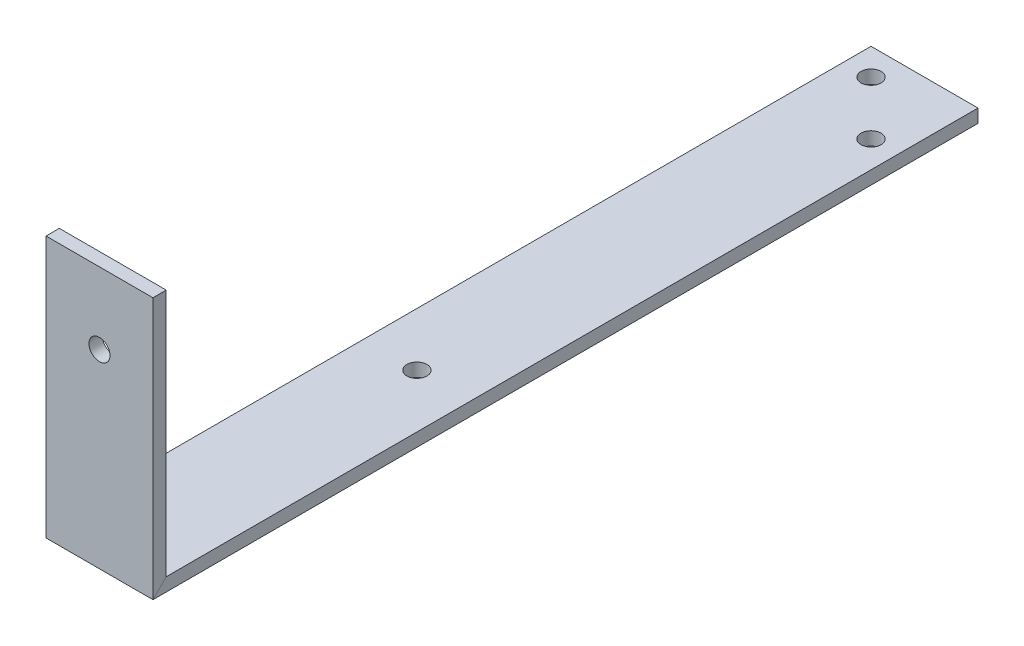
ISO-10303-21;
HEADER;
FILE_DESCRIPTION(('STEP AP214'),'2;1');
FILE_NAME('part.step','',(''),(''),'','','');
FILE_SCHEMA(('AUTOMOTIVE_DESIGN { 1 0 10303 214 1 1 1 1 }'));
ENDSEC;
DATA;
#1=APPLICATION_CONTEXT('core data for automotive mechanical design processes');
#2=APPLICATION_PROTOCOL_DEFINITION('international standard','automotive_design',2000,#1);
#3=PRODUCT_CONTEXT('',#1,'mechanical');
#4=PRODUCT('Part','Part','',(#3));
#5=PRODUCT_RELATED_PRODUCT_CATEGORY('part','',(#4));
#6=PRODUCT_DEFINITION_FORMATION('','',#4);
#7=PRODUCT_DEFINITION_CONTEXT('part definition',#1,'design');
#8=PRODUCT_DEFINITION('design','',#6,#7);
#9=PRODUCT_DEFINITION_SHAPE('','',#8);
#10=(LENGTH_UNIT() NAMED_UNIT(*) SI_UNIT(.MILLI.,.METRE.));
#11=(NAMED_UNIT(*) PLANE_ANGLE_UNIT() SI_UNIT($,.RADIAN.));
#12=(NAMED_UNIT(*) SI_UNIT($,.STERADIAN.) SOLID_ANGLE_UNIT());
#13=UNCERTAINTY_MEASURE_WITH_UNIT(LENGTH_MEASURE(1.E-05),#10,'distance_accuracy_value','');
#14=(GEOMETRIC_REPRESENTATION_CONTEXT(3) GLOBAL_UNCERTAINTY_ASSIGNED_CONTEXT((#13)) GLOBAL_UNIT_ASSIGNED_CONTEXT((#10,
#11,#12)) REPRESENTATION_CONTEXT('',''));
#15=CARTESIAN_POINT('',(0.,0.,0.));
#16=DIRECTION('',(0.,0.,1.));
#17=DIRECTION('',(1.,0.,0.));
#18=AXIS2_PLACEMENT_3D('',#15,#16,#17);
#19=CARTESIAN_POINT('',(1761.3,-570.8105,696.315));
#20=DIRECTION('',(0.,0.,-1.));
#21=DIRECTION('',(-1.,0.,0.));
#22=AXIS2_PLACEMENT_3D('',#19,#20,#21);
#23=PLANE('',#22);
#24=CARTESIAN_POINT('',(1786.7,-480.185,696.315));
#25=DIRECTION('',(0.,0.,-1.));
#26=DIRECTION('',(-1.,0.,0.));
#27=AXIS2_PLACEMENT_3D('',#24,#25,#26);
#28=CIRCLE('',#27,4.99999999999982);
#29=CARTESIAN_POINT('',(1781.7,-480.185,696.315));
#30=VERTEX_POINT('',#29);
#31=EDGE_CURVE('E136',#30,#30,#28,.T.);
#32=ORIENTED_EDGE('',*,*,#31,.T.);
#33=EDGE_LOOP('',(#32));
#34=FACE_BOUND('',#33,.T.);
#35=DIRECTION('',(1.,0.,0.));
#36=VECTOR('',#35,1.);
#37=CARTESIAN_POINT('',(0.,-446.185,696.315));
#38=LINE('',#37,#36);
#39=CARTESIAN_POINT('',(1761.3,-446.185,696.315));
#40=VERTEX_POINT('',#39);
#41=CARTESIAN_POINT('',(1812.1,-446.185,696.315));
#42=VERTEX_POINT('',#41);
#43=EDGE_CURVE('E158',#40,#42,#38,.T.);
#44=ORIENTED_EDGE('',*,*,#43,.F.);
#45=DIRECTION('',(0.,1.,0.));
#46=VECTOR('',#45,1.);
#47=CARTESIAN_POINT('',(1761.3,-570.8105,696.315));
#48=LINE('',#47,#46);
#49=CARTESIAN_POINT('',(1761.3,-570.395,696.315));
#50=VERTEX_POINT('',#49);
#51=EDGE_CURVE('E127',#50,#40,#48,.T.);
#52=ORIENTED_EDGE('',*,*,#51,.F.);
#53=DIRECTION('',(1.,0.,0.));
#54=VECTOR('',#53,1.);
#55=CARTESIAN_POINT('',(1761.3,-570.395,696.315));
#56=LINE('',#55,#54);
#57=CARTESIAN_POINT('',(1812.1,-570.395,696.315));
#58=VERTEX_POINT('',#57);
#59=EDGE_CURVE('E116',#50,#58,#56,.T.);
#60=ORIENTED_EDGE('',*,*,#59,.T.);
#61=DIRECTION('',(0.,1.,0.));
#62=VECTOR('',#61,1.);
#63=CARTESIAN_POINT('',(1812.1,-570.8105,696.315));
#64=LINE('',#63,#62);
#65=EDGE_CURVE('E117',#58,#42,#64,.T.);
#66=ORIENTED_EDGE('',*,*,#65,.T.);
#67=EDGE_LOOP('',(#44,#52,#60,#66));
#68=FACE_BOUND('',#67,.T.);
#69=ADVANCED_FACE('F34',(#34,#68),#23,.F.);
#70=CARTESIAN_POINT('',(1812.1,-570.8105,696.315));
#71=DIRECTION('',(-1.,0.,0.));
#72=DIRECTION('',(0.,0.,1.));
#73=AXIS2_PLACEMENT_3D('',#70,#71,#72);
#74=PLANE('',#73);
#75=DIRECTION('',(0.,0.,-1.));
#76=VECTOR('',#75,1.);
#77=CARTESIAN_POINT('',(1812.1,-446.185,696.315));
#78=LINE('',#77,#76);
#79=CARTESIAN_POINT('',(1812.1,-446.185,690.005));
#80=VERTEX_POINT('',#79);
#81=EDGE_CURVE('E121',#42,#80,#78,.T.);
#82=ORIENTED_EDGE('',*,*,#81,.F.);
#83=ORIENTED_EDGE('',*,*,#65,.F.);
#84=DIRECTION('',(0.,0.707106781186548,-0.707106781186548));
#85=VECTOR('',#84,1.);
#86=CARTESIAN_POINT('',(1812.1,-376.3175,502.2375));
#87=LINE('',#86,#85);
#88=CARTESIAN_POINT('',(1812.1,-564.085,690.005));
#89=VERTEX_POINT('',#88);
#90=EDGE_CURVE('E42',#58,#89,#87,.T.);
#91=ORIENTED_EDGE('',*,*,#90,.T.);
#92=DIRECTION('',(0.,1.,0.));
#93=VECTOR('',#92,1.);
#94=CARTESIAN_POINT('',(1812.1,-570.8105,690.005));
#95=LINE('',#94,#93);
#96=EDGE_CURVE('E120',#89,#80,#95,.T.);
#97=ORIENTED_EDGE('',*,*,#96,.T.);
#98=EDGE_LOOP('',(#82,#83,#91,#97));
#99=FACE_BOUND('',#98,.T.);
#100=ADVANCED_FACE('F175',(#99),#74,.F.);
#101=CARTESIAN_POINT('',(1761.3,-570.8105,690.005));
#102=DIRECTION('',(0.,0.,1.));
#103=DIRECTION('',(1.,0.,0.));
#104=AXIS2_PLACEMENT_3D('',#101,#102,#103);
#105=PLANE('',#104);
#106=CARTESIAN_POINT('',(1786.7,-480.185,690.005));
#107=DIRECTION('',(0.,0.,-1.));
#108=DIRECTION('',(-1.,0.,0.));
#109=AXIS2_PLACEMENT_3D('',#106,#107,#108);
#110=CIRCLE('',#109,4.99999999999982);
#111=CARTESIAN_POINT('',(1781.7,-480.185,690.005));
#112=VERTEX_POINT('',#111);
#113=EDGE_CURVE('E131',#112,#112,#110,.T.);
#114=ORIENTED_EDGE('',*,*,#113,.F.);
#115=EDGE_LOOP('',(#114));
#116=FACE_BOUND('',#115,.T.);
#117=DIRECTION('',(-1.,0.,0.));
#118=VECTOR('',#117,1.);
#119=CARTESIAN_POINT('',(0.,-446.185,690.005));
#120=LINE('',#119,#118);
#121=CARTESIAN_POINT('',(1761.3,-446.185,690.005));
#122=VERTEX_POINT('',#121);
#123=EDGE_CURVE('E58',#80,#122,#120,.T.);
#124=ORIENTED_EDGE('',*,*,#123,.F.);
#125=ORIENTED_EDGE('',*,*,#96,.F.);
#126=DIRECTION('',(-1.,0.,0.));
#127=VECTOR('',#126,1.);
#128=CARTESIAN_POINT('',(1761.3,-564.085,690.005));
#129=LINE('',#128,#127);
#130=CARTESIAN_POINT('',(1761.3,-564.085,690.005));
#131=VERTEX_POINT('',#130);
#132=EDGE_CURVE('E11',#89,#131,#129,.T.);
#133=ORIENTED_EDGE('',*,*,#132,.T.);
#134=DIRECTION('',(0.,1.,0.));
#135=VECTOR('',#134,1.);
#136=CARTESIAN_POINT('',(1761.3,-570.8105,690.005));
#137=LINE('',#136,#135);
#138=EDGE_CURVE('E124',#131,#122,#137,.T.);
#139=ORIENTED_EDGE('',*,*,#138,.T.);
#140=EDGE_LOOP('',(#124,#125,#133,#139));
#141=FACE_BOUND('',#140,.T.);
#142=ADVANCED_FACE('F182',(#116,#141),#105,.F.);
#143=CARTESIAN_POINT('',(1761.3,-570.8105,696.315));
#144=DIRECTION('',(1.,0.,0.));
#145=DIRECTION('',(0.,0.,-1.));
#146=AXIS2_PLACEMENT_3D('',#143,#144,#145);
#147=PLANE('',#146);
#148=DIRECTION('',(0.,0.,1.));
#149=VECTOR('',#148,1.);
#150=CARTESIAN_POINT('',(1761.3,-446.185,0.));
#151=LINE('',#150,#149);
#152=EDGE_CURVE('E156',#122,#40,#151,.T.);
#153=ORIENTED_EDGE('',*,*,#152,.F.);
#154=ORIENTED_EDGE('',*,*,#138,.F.);
#155=DIRECTION('',(0.,-0.707106781186548,0.707106781186548));
#156=VECTOR('',#155,1.);
#157=CARTESIAN_POINT('',(1761.3,-376.3175,502.2375));
#158=LINE('',#157,#156);
#159=EDGE_CURVE('E106',#131,#50,#158,.T.);
#160=ORIENTED_EDGE('',*,*,#159,.T.);
#161=ORIENTED_EDGE('',*,*,#51,.T.);
#162=EDGE_LOOP('',(#153,#154,#160,#161));
#163=FACE_BOUND('',#162,.T.);
#164=ADVANCED_FACE('F179',(#163),#147,.F.);
#165=CARTESIAN_POINT('',(1761.3,-570.395,308.16));
#166=DIRECTION('',(0.,1.,0.));
#167=DIRECTION('',(0.,0.,1.));
#168=AXIS2_PLACEMENT_3D('',#165,#166,#167);
#169=PLANE('',#168);
#170=CARTESIAN_POINT('',(1773.99999999906,-570.395,317.152204665887));
#171=DIRECTION('',(0.,-1.,0.));
#172=DIRECTION('',(0.,0.,-1.));
#173=AXIS2_PLACEMENT_3D('',#170,#171,#172);
#174=CIRCLE('',#173,4.7624999999999);
#175=CARTESIAN_POINT('',(1773.99999999906,-570.395,312.389704665887));
#176=VERTEX_POINT('',#175);
#177=EDGE_CURVE('E143',#176,#176,#174,.T.);
#178=ORIENTED_EDGE('',*,*,#177,.F.);
#179=EDGE_LOOP('',(#178));
#180=FACE_BOUND('',#179,.T.);
#181=CARTESIAN_POINT('',(1799.39999999906,-570.395,342.552204665886));
#182=DIRECTION('',(0.,-1.,0.));
#183=DIRECTION('',(0.,0.,-1.));
#184=AXIS2_PLACEMENT_3D('',#181,#182,#183);
#185=CIRCLE('',#184,4.76250000000011);
#186=CARTESIAN_POINT('',(1799.39999999906,-570.395,337.789704665886));
#187=VERTEX_POINT('',#186);
#188=EDGE_CURVE('E132',#187,#187,#185,.T.);
#189=ORIENTED_EDGE('',*,*,#188,.F.);
#190=EDGE_LOOP('',(#189));
#191=FACE_BOUND('',#190,.T.);
#192=CARTESIAN_POINT('',(1786.69999999999,-570.395,545.545000000005));
#193=DIRECTION('',(0.,1.,0.));
#194=DIRECTION('',(0.,0.,1.));
#195=AXIS2_PLACEMENT_3D('',#192,#193,#194);
#196=CIRCLE('',#195,4.76249999999989);
#197=CARTESIAN_POINT('',(1786.69999999999,-570.395,550.307500000005));
#198=VERTEX_POINT('',#197);
#199=EDGE_CURVE('E102',#198,#198,#196,.T.);
#200=ORIENTED_EDGE('',*,*,#199,.T.);
#201=EDGE_LOOP('',(#200));
#202=FACE_BOUND('',#201,.T.);
#203=DIRECTION('',(0.,0.,1.));
#204=VECTOR('',#203,1.);
#205=CARTESIAN_POINT('',(1761.3,-570.395,308.16));
#206=LINE('',#205,#204);
#207=CARTESIAN_POINT('',(1761.3,-570.395,304.45));
#208=VERTEX_POINT('',#207);
#209=EDGE_CURVE('E108',#208,#50,#206,.T.);
#210=ORIENTED_EDGE('',*,*,#209,.F.);
#211=DIRECTION('',(1.,0.,0.));
#212=VECTOR('',#211,1.);
#213=CARTESIAN_POINT('',(1761.3,-570.395,304.45));
#214=LINE('',#213,#212);
#215=CARTESIAN_POINT('',(1812.1,-570.395,304.45));
#216=VERTEX_POINT('',#215);
#217=EDGE_CURVE('E50',#208,#216,#214,.T.);
#218=ORIENTED_EDGE('',*,*,#217,.T.);
#219=DIRECTION('',(0.,0.,1.));
#220=VECTOR('',#219,1.);
#221=CARTESIAN_POINT('',(1812.1,-570.395,308.16));
#222=LINE('',#221,#220);
#223=EDGE_CURVE('E111',#216,#58,#222,.T.);
#224=ORIENTED_EDGE('',*,*,#223,.T.);
#225=ORIENTED_EDGE('',*,*,#59,.F.);
#226=EDGE_LOOP('',(#210,#218,#224,#225));
#227=FACE_BOUND('',#226,.T.);
#228=ADVANCED_FACE('F168',(#180,#191,#202,#227),#169,.F.);
#229=CARTESIAN_POINT('',(1812.1,-570.395,308.16));
#230=DIRECTION('',(-1.,0.,0.));
#231=DIRECTION('',(0.,0.,1.));
#232=AXIS2_PLACEMENT_3D('',#229,#230,#231);
#233=PLANE('',#232);
#234=ORIENTED_EDGE('',*,*,#223,.F.);
#235=DIRECTION('',(0.,1.,0.));
#236=VECTOR('',#235,1.);
#237=CARTESIAN_POINT('',(1812.1,-570.435,304.45));
#238=LINE('',#237,#236);
#239=CARTESIAN_POINT('',(1812.1,-564.085,304.45));
#240=VERTEX_POINT('',#239);
#241=EDGE_CURVE('E93',#216,#240,#238,.T.);
#242=ORIENTED_EDGE('',*,*,#241,.T.);
#243=DIRECTION('',(0.,0.,1.));
#244=VECTOR('',#243,1.);
#245=CARTESIAN_POINT('',(1812.1,-564.085,308.16));
#246=LINE('',#245,#244);
#247=EDGE_CURVE('E101',#240,#89,#246,.T.);
#248=ORIENTED_EDGE('',*,*,#247,.T.);
#249=ORIENTED_EDGE('',*,*,#90,.F.);
#250=EDGE_LOOP('',(#234,#242,#248,#249));
#251=FACE_BOUND('',#250,.T.);
#252=ADVANCED_FACE('F172',(#251),#233,.F.);
#253=CARTESIAN_POINT('',(1761.3,-564.085,308.16));
#254=DIRECTION('',(0.,-1.,0.));
#255=DIRECTION('',(0.,0.,-1.));
#256=AXIS2_PLACEMENT_3D('',#253,#254,#255);
#257=PLANE('',#256);
#258=CARTESIAN_POINT('',(1773.99999999906,-564.085,317.152204665887));
#259=DIRECTION('',(0.,-1.,0.));
#260=DIRECTION('',(0.,0.,-1.));
#261=AXIS2_PLACEMENT_3D('',#258,#259,#260);
#262=CIRCLE('',#261,4.7624999999999);
#263=CARTESIAN_POINT('',(1773.99999999906,-564.085,312.389704665887));
#264=VERTEX_POINT('',#263);
#265=EDGE_CURVE('E37',#264,#264,#262,.T.);
#266=ORIENTED_EDGE('',*,*,#265,.T.);
#267=EDGE_LOOP('',(#266));
#268=FACE_BOUND('',#267,.T.);
#269=CARTESIAN_POINT('',(1799.39999999906,-564.085,342.552204665886));
#270=DIRECTION('',(0.,-1.,0.));
#271=DIRECTION('',(0.,0.,-1.));
#272=AXIS2_PLACEMENT_3D('',#269,#270,#271);
#273=CIRCLE('',#272,4.76250000000011);
#274=CARTESIAN_POINT('',(1799.39999999906,-564.085,337.789704665886));
#275=VERTEX_POINT('',#274);
#276=EDGE_CURVE('E129',#275,#275,#273,.T.);
#277=ORIENTED_EDGE('',*,*,#276,.T.);
#278=EDGE_LOOP('',(#277));
#279=FACE_BOUND('',#278,.T.);
#280=CARTESIAN_POINT('',(1786.69999999999,-564.085,545.545000000005));
#281=DIRECTION('',(0.,1.,0.));
#282=DIRECTION('',(0.,0.,1.));
#283=AXIS2_PLACEMENT_3D('',#280,#281,#282);
#284=CIRCLE('',#283,4.76249999999989);
#285=CARTESIAN_POINT('',(1786.69999999999,-564.085,550.307500000005));
#286=VERTEX_POINT('',#285);
#287=EDGE_CURVE('E148',#286,#286,#284,.T.);
#288=ORIENTED_EDGE('',*,*,#287,.F.);
#289=EDGE_LOOP('',(#288));
#290=FACE_BOUND('',#289,.T.);
#291=ORIENTED_EDGE('',*,*,#247,.F.);
#292=DIRECTION('',(1.,0.,0.));
#293=VECTOR('',#292,1.);
#294=CARTESIAN_POINT('',(1812.1,-564.085,304.45));
#295=LINE('',#294,#293);
#296=CARTESIAN_POINT('',(1761.3,-564.085,304.45));
#297=VERTEX_POINT('',#296);
#298=EDGE_CURVE('E88',#297,#240,#295,.T.);
#299=ORIENTED_EDGE('',*,*,#298,.F.);
#300=DIRECTION('',(0.,0.,1.));
#301=VECTOR('',#300,1.);
#302=CARTESIAN_POINT('',(1761.3,-564.085,308.16));
#303=LINE('',#302,#301);
#304=EDGE_CURVE('E99',#297,#131,#303,.T.);
#305=ORIENTED_EDGE('',*,*,#304,.T.);
#306=ORIENTED_EDGE('',*,*,#132,.F.);
#307=EDGE_LOOP('',(#291,#299,#305,#306));
#308=FACE_BOUND('',#307,.T.);
#309=ADVANCED_FACE('F97',(#268,#279,#290,#308),#257,.F.);
#310=CARTESIAN_POINT('',(1761.3,-570.395,308.16));
#311=DIRECTION('',(1.,0.,0.));
#312=DIRECTION('',(0.,0.,-1.));
#313=AXIS2_PLACEMENT_3D('',#310,#311,#312);
#314=PLANE('',#313);
#315=ORIENTED_EDGE('',*,*,#304,.F.);
#316=DIRECTION('',(0.,1.,0.));
#317=VECTOR('',#316,1.);
#318=CARTESIAN_POINT('',(1761.3,-570.435,304.45));
#319=LINE('',#318,#317);
#320=EDGE_CURVE('E85',#208,#297,#319,.T.);
#321=ORIENTED_EDGE('',*,*,#320,.F.);
#322=ORIENTED_EDGE('',*,*,#209,.T.);
#323=ORIENTED_EDGE('',*,*,#159,.F.);
#324=EDGE_LOOP('',(#315,#321,#322,#323));
#325=FACE_BOUND('',#324,.T.);
#326=ADVANCED_FACE('F104',(#325),#314,.F.);
#327=CARTESIAN_POINT('',(0.,-446.185,0.));
#328=DIRECTION('',(0.,1.,0.));
#329=DIRECTION('',(0.,0.,1.));
#330=AXIS2_PLACEMENT_3D('',#327,#328,#329);
#331=PLANE('',#330);
#332=ORIENTED_EDGE('',*,*,#81,.T.);
#333=ORIENTED_EDGE('',*,*,#123,.T.);
#334=ORIENTED_EDGE('',*,*,#152,.T.);
#335=ORIENTED_EDGE('',*,*,#43,.T.);
#336=EDGE_LOOP('',(#332,#333,#334,#335));
#337=FACE_BOUND('',#336,.T.);
#338=ADVANCED_FACE('F216',(#337),#331,.T.);
#339=CARTESIAN_POINT('',(1812.1,-570.435,304.45));
#340=DIRECTION('',(0.,0.,1.));
#341=DIRECTION('',(1.,0.,0.));
#342=AXIS2_PLACEMENT_3D('',#339,#340,#341);
#343=PLANE('',#342);
#344=ORIENTED_EDGE('',*,*,#320,.T.);
#345=ORIENTED_EDGE('',*,*,#298,.T.);
#346=ORIENTED_EDGE('',*,*,#241,.F.);
#347=ORIENTED_EDGE('',*,*,#217,.F.);
#348=EDGE_LOOP('',(#344,#345,#346,#347));
#349=FACE_BOUND('',#348,.T.);
#350=ADVANCED_FACE('F87',(#349),#343,.F.);
#351=CARTESIAN_POINT('',(1786.69999999999,-597.085,545.545000000005));
#352=DIRECTION('',(0.,1.,0.));
#353=DIRECTION('',(0.,0.,1.));
#354=AXIS2_PLACEMENT_3D('',#351,#352,#353);
#355=CYLINDRICAL_SURFACE('',#354,4.76249999999989);
#356=ORIENTED_EDGE('',*,*,#287,.T.);
#357=EDGE_LOOP('',(#356));
#358=FACE_BOUND('',#357,.T.);
#359=ORIENTED_EDGE('',*,*,#199,.F.);
#360=EDGE_LOOP('',(#359));
#361=FACE_BOUND('',#360,.T.);
#362=ADVANCED_FACE('F201',(#358,#361),#355,.F.);
#363=CARTESIAN_POINT('',(1786.7,-480.185,723.005));
#364=DIRECTION('',(0.,0.,-1.));
#365=DIRECTION('',(-1.,0.,0.));
#366=AXIS2_PLACEMENT_3D('',#363,#364,#365);
#367=CYLINDRICAL_SURFACE('',#366,4.99999999999982);
#368=ORIENTED_EDGE('',*,*,#113,.T.);
#369=EDGE_LOOP('',(#368));
#370=FACE_BOUND('',#369,.T.);
#371=ORIENTED_EDGE('',*,*,#31,.F.);
#372=EDGE_LOOP('',(#371));
#373=FACE_BOUND('',#372,.T.);
#374=ADVANCED_FACE('F198',(#370,#373),#367,.F.);
#375=CARTESIAN_POINT('',(1799.39999999906,-520.395,342.552204665886));
#376=DIRECTION('',(0.,-1.,0.));
#377=DIRECTION('',(0.,0.,-1.));
#378=AXIS2_PLACEMENT_3D('',#375,#376,#377);
#379=CYLINDRICAL_SURFACE('',#378,4.76250000000011);
#380=ORIENTED_EDGE('',*,*,#188,.T.);
#381=EDGE_LOOP('',(#380));
#382=FACE_BOUND('',#381,.T.);
#383=ORIENTED_EDGE('',*,*,#276,.F.);
#384=EDGE_LOOP('',(#383));
#385=FACE_BOUND('',#384,.T.);
#386=ADVANCED_FACE('F200',(#382,#385),#379,.F.);
#387=CARTESIAN_POINT('',(1773.99999999906,-520.395,317.152204665887));
#388=DIRECTION('',(0.,-1.,0.));
#389=DIRECTION('',(0.,0.,-1.));
#390=AXIS2_PLACEMENT_3D('',#387,#388,#389);
#391=CYLINDRICAL_SURFACE('',#390,4.7624999999999);
#392=ORIENTED_EDGE('',*,*,#177,.T.);
#393=EDGE_LOOP('',(#392));
#394=FACE_BOUND('',#393,.T.);
#395=ORIENTED_EDGE('',*,*,#265,.F.);
#396=EDGE_LOOP('',(#395));
#397=FACE_BOUND('',#396,.T.);
#398=ADVANCED_FACE('F208',(#394,#397),#391,.F.);
#399=CLOSED_SHELL('',(#69,#100,#142,#164,#228,#252,#309,#326,#338,#350,#362,#374,#386,#398));
#400=MANIFOLD_SOLID_BREP('B2',#399);
#401=ADVANCED_BREP_SHAPE_REPRESENTATION('',(#18,#400),#14);
#402=SHAPE_DEFINITION_REPRESENTATION(#9,#401);
ENDSEC;
END-ISO-10303-21;
